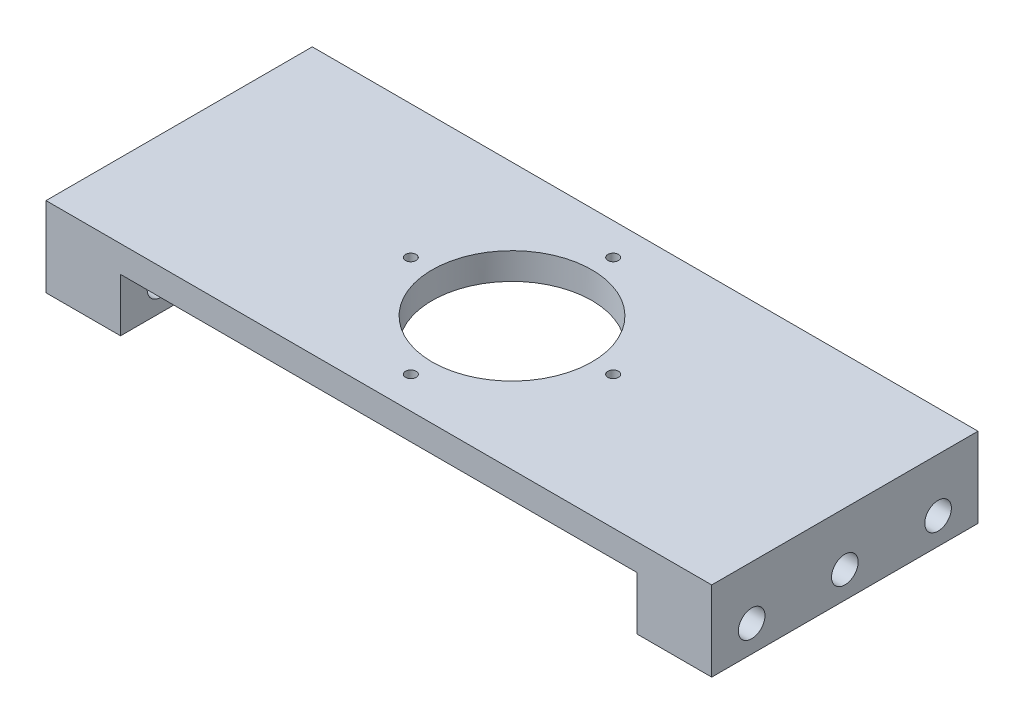
ISO-10303-21;
HEADER;
FILE_DESCRIPTION(('STEP AP214'),'2;1');
FILE_NAME('part.step','',(''),(''),'','','');
FILE_SCHEMA(('AUTOMOTIVE_DESIGN { 1 0 10303 214 1 1 1 1 }'));
ENDSEC;
DATA;
#1=APPLICATION_CONTEXT('core data for automotive mechanical design processes');
#2=APPLICATION_PROTOCOL_DEFINITION('international standard','automotive_design',2000,#1);
#3=PRODUCT_CONTEXT('',#1,'mechanical');
#4=PRODUCT('Part','Part','',(#3));
#5=PRODUCT_RELATED_PRODUCT_CATEGORY('part','',(#4));
#6=PRODUCT_DEFINITION_FORMATION('','',#4);
#7=PRODUCT_DEFINITION_CONTEXT('part definition',#1,'design');
#8=PRODUCT_DEFINITION('design','',#6,#7);
#9=PRODUCT_DEFINITION_SHAPE('','',#8);
#10=(LENGTH_UNIT() NAMED_UNIT(*) SI_UNIT(.MILLI.,.METRE.));
#11=(NAMED_UNIT(*) PLANE_ANGLE_UNIT() SI_UNIT($,.RADIAN.));
#12=(NAMED_UNIT(*) SI_UNIT($,.STERADIAN.) SOLID_ANGLE_UNIT());
#13=UNCERTAINTY_MEASURE_WITH_UNIT(LENGTH_MEASURE(1.E-05),#10,'distance_accuracy_value','');
#14=(GEOMETRIC_REPRESENTATION_CONTEXT(3) GLOBAL_UNCERTAINTY_ASSIGNED_CONTEXT((#13)) GLOBAL_UNIT_ASSIGNED_CONTEXT((#10,
#11,#12)) REPRESENTATION_CONTEXT('',''));
#15=CARTESIAN_POINT('',(0.,0.,0.));
#16=DIRECTION('',(0.,0.,1.));
#17=DIRECTION('',(1.,0.,0.));
#18=AXIS2_PLACEMENT_3D('',#15,#16,#17);
#19=CARTESIAN_POINT('',(0.,10.,50.));
#20=DIRECTION('',(0.,0.,-1.));
#21=DIRECTION('',(-1.,0.,0.));
#22=AXIS2_PLACEMENT_3D('',#19,#20,#21);
#23=PLANE('',#22);
#24=DIRECTION('',(0.,-1.,0.));
#25=VECTOR('',#24,1.);
#26=CARTESIAN_POINT('',(-125.,10.,50.));
#27=LINE('',#26,#25);
#28=CARTESIAN_POINT('',(-125.,10.,50.));
#29=VERTEX_POINT('',#28);
#30=CARTESIAN_POINT('',(-125.,-20.,50.));
#31=VERTEX_POINT('',#30);
#32=EDGE_CURVE('E187',#29,#31,#27,.T.);
#33=ORIENTED_EDGE('',*,*,#32,.T.);
#34=DIRECTION('',(-1.,0.,0.));
#35=VECTOR('',#34,1.);
#36=CARTESIAN_POINT('',(-125.,-20.,50.));
#37=LINE('',#36,#35);
#38=CARTESIAN_POINT('',(-97.,-20.,50.));
#39=VERTEX_POINT('',#38);
#40=EDGE_CURVE('E147',#39,#31,#37,.T.);
#41=ORIENTED_EDGE('',*,*,#40,.F.);
#42=DIRECTION('',(0.,1.,0.));
#43=VECTOR('',#42,1.);
#44=CARTESIAN_POINT('',(-97.,-20.,50.));
#45=LINE('',#44,#43);
#46=CARTESIAN_POINT('',(-97.,0.,50.));
#47=VERTEX_POINT('',#46);
#48=EDGE_CURVE('E161',#39,#47,#45,.T.);
#49=ORIENTED_EDGE('',*,*,#48,.T.);
#50=DIRECTION('',(1.,0.,0.));
#51=VECTOR('',#50,1.);
#52=CARTESIAN_POINT('',(0.,0.,50.));
#53=LINE('',#52,#51);
#54=CARTESIAN_POINT('',(97.,0.,50.));
#55=VERTEX_POINT('',#54);
#56=EDGE_CURVE('E112',#47,#55,#53,.T.);
#57=ORIENTED_EDGE('',*,*,#56,.T.);
#58=DIRECTION('',(0.,1.,0.));
#59=VECTOR('',#58,1.);
#60=CARTESIAN_POINT('',(97.,-20.,50.));
#61=LINE('',#60,#59);
#62=CARTESIAN_POINT('',(97.,-20.,50.));
#63=VERTEX_POINT('',#62);
#64=EDGE_CURVE('E106',#63,#55,#61,.T.);
#65=ORIENTED_EDGE('',*,*,#64,.F.);
#66=DIRECTION('',(1.,0.,0.));
#67=VECTOR('',#66,1.);
#68=CARTESIAN_POINT('',(125.,-20.,50.));
#69=LINE('',#68,#67);
#70=CARTESIAN_POINT('',(125.,-20.,50.));
#71=VERTEX_POINT('',#70);
#72=EDGE_CURVE('E109',#63,#71,#69,.T.);
#73=ORIENTED_EDGE('',*,*,#72,.T.);
#74=DIRECTION('',(0.,-1.,0.));
#75=VECTOR('',#74,1.);
#76=CARTESIAN_POINT('',(125.,10.,50.));
#77=LINE('',#76,#75);
#78=CARTESIAN_POINT('',(125.,10.,50.));
#79=VERTEX_POINT('',#78);
#80=EDGE_CURVE('E11',#79,#71,#77,.T.);
#81=ORIENTED_EDGE('',*,*,#80,.F.);
#82=DIRECTION('',(1.,0.,0.));
#83=VECTOR('',#82,1.);
#84=CARTESIAN_POINT('',(0.,10.,50.));
#85=LINE('',#84,#83);
#86=EDGE_CURVE('E176',#29,#79,#85,.T.);
#87=ORIENTED_EDGE('',*,*,#86,.F.);
#88=EDGE_LOOP('',(#33,#41,#49,#57,#65,#73,#81,#87));
#89=FACE_BOUND('',#88,.T.);
#90=ADVANCED_FACE('F39',(#89),#23,.F.);
#91=CARTESIAN_POINT('',(125.,10.,-50.));
#92=DIRECTION('',(-1.,0.,0.));
#93=DIRECTION('',(0.,0.,1.));
#94=AXIS2_PLACEMENT_3D('',#91,#92,#93);
#95=PLANE('',#94);
#96=CARTESIAN_POINT('',(125.,-10.,-35.));
#97=DIRECTION('',(1.,0.,0.));
#98=DIRECTION('',(0.,0.,-1.));
#99=AXIS2_PLACEMENT_3D('',#96,#97,#98);
#100=CIRCLE('',#99,5.);
#101=CARTESIAN_POINT('',(125.,-10.,-40.));
#102=VERTEX_POINT('',#101);
#103=EDGE_CURVE('E225',#102,#102,#100,.T.);
#104=ORIENTED_EDGE('',*,*,#103,.F.);
#105=EDGE_LOOP('',(#104));
#106=FACE_BOUND('',#105,.T.);
#107=CARTESIAN_POINT('',(125.,-10.,35.));
#108=DIRECTION('',(1.,0.,0.));
#109=DIRECTION('',(0.,0.,-1.));
#110=AXIS2_PLACEMENT_3D('',#107,#108,#109);
#111=CIRCLE('',#110,5.);
#112=CARTESIAN_POINT('',(125.,-10.,30.));
#113=VERTEX_POINT('',#112);
#114=EDGE_CURVE('E230',#113,#113,#111,.T.);
#115=ORIENTED_EDGE('',*,*,#114,.F.);
#116=EDGE_LOOP('',(#115));
#117=FACE_BOUND('',#116,.T.);
#118=CARTESIAN_POINT('',(125.,-10.,0.));
#119=DIRECTION('',(1.,0.,0.));
#120=DIRECTION('',(0.,0.,-1.));
#121=AXIS2_PLACEMENT_3D('',#118,#119,#120);
#122=CIRCLE('',#121,5.);
#123=CARTESIAN_POINT('',(125.,-10.,-5.));
#124=VERTEX_POINT('',#123);
#125=EDGE_CURVE('E207',#124,#124,#122,.T.);
#126=ORIENTED_EDGE('',*,*,#125,.F.);
#127=EDGE_LOOP('',(#126));
#128=FACE_BOUND('',#127,.T.);
#129=ORIENTED_EDGE('',*,*,#80,.T.);
#130=DIRECTION('',(0.,0.,-1.));
#131=VECTOR('',#130,1.);
#132=CARTESIAN_POINT('',(125.,-20.,50.));
#133=LINE('',#132,#131);
#134=CARTESIAN_POINT('',(125.,-20.,-50.));
#135=VERTEX_POINT('',#134);
#136=EDGE_CURVE('E128',#71,#135,#133,.T.);
#137=ORIENTED_EDGE('',*,*,#136,.T.);
#138=DIRECTION('',(0.,-1.,0.));
#139=VECTOR('',#138,1.);
#140=CARTESIAN_POINT('',(125.,10.,-50.));
#141=LINE('',#140,#139);
#142=CARTESIAN_POINT('',(125.,10.,-50.));
#143=VERTEX_POINT('',#142);
#144=EDGE_CURVE('E48',#143,#135,#141,.T.);
#145=ORIENTED_EDGE('',*,*,#144,.F.);
#146=DIRECTION('',(0.,0.,-1.));
#147=VECTOR('',#146,1.);
#148=CARTESIAN_POINT('',(125.,10.,-50.));
#149=LINE('',#148,#147);
#150=EDGE_CURVE('E179',#79,#143,#149,.T.);
#151=ORIENTED_EDGE('',*,*,#150,.F.);
#152=EDGE_LOOP('',(#129,#137,#145,#151));
#153=FACE_BOUND('',#152,.T.);
#154=ADVANCED_FACE('F244',(#106,#117,#128,#153),#95,.F.);
#155=CARTESIAN_POINT('',(-125.,10.,-50.));
#156=DIRECTION('',(0.,0.,1.));
#157=DIRECTION('',(1.,0.,0.));
#158=AXIS2_PLACEMENT_3D('',#155,#156,#157);
#159=PLANE('',#158);
#160=ORIENTED_EDGE('',*,*,#144,.T.);
#161=DIRECTION('',(-1.,0.,0.));
#162=VECTOR('',#161,1.);
#163=CARTESIAN_POINT('',(97.,-20.,-50.));
#164=LINE('',#163,#162);
#165=CARTESIAN_POINT('',(97.,-20.,-50.));
#166=VERTEX_POINT('',#165);
#167=EDGE_CURVE('E134',#135,#166,#164,.T.);
#168=ORIENTED_EDGE('',*,*,#167,.T.);
#169=DIRECTION('',(0.,1.,0.));
#170=VECTOR('',#169,1.);
#171=CARTESIAN_POINT('',(97.,-20.,-50.));
#172=LINE('',#171,#170);
#173=CARTESIAN_POINT('',(97.,0.,-50.));
#174=VERTEX_POINT('',#173);
#175=EDGE_CURVE('E119',#166,#174,#172,.T.);
#176=ORIENTED_EDGE('',*,*,#175,.T.);
#177=DIRECTION('',(-1.,0.,0.));
#178=VECTOR('',#177,1.);
#179=CARTESIAN_POINT('',(-125.,0.,-50.));
#180=LINE('',#179,#178);
#181=CARTESIAN_POINT('',(-97.,0.,-50.));
#182=VERTEX_POINT('',#181);
#183=EDGE_CURVE('E56',#174,#182,#180,.T.);
#184=ORIENTED_EDGE('',*,*,#183,.T.);
#185=DIRECTION('',(0.,1.,0.));
#186=VECTOR('',#185,1.);
#187=CARTESIAN_POINT('',(-97.,-20.,-50.));
#188=LINE('',#187,#186);
#189=CARTESIAN_POINT('',(-97.,-20.,-50.));
#190=VERTEX_POINT('',#189);
#191=EDGE_CURVE('E167',#190,#182,#188,.T.);
#192=ORIENTED_EDGE('',*,*,#191,.F.);
#193=DIRECTION('',(1.,0.,0.));
#194=VECTOR('',#193,1.);
#195=CARTESIAN_POINT('',(-97.,-20.,-50.));
#196=LINE('',#195,#194);
#197=CARTESIAN_POINT('',(-125.,-20.,-50.));
#198=VERTEX_POINT('',#197);
#199=EDGE_CURVE('E155',#198,#190,#196,.T.);
#200=ORIENTED_EDGE('',*,*,#199,.F.);
#201=DIRECTION('',(0.,-1.,0.));
#202=VECTOR('',#201,1.);
#203=CARTESIAN_POINT('',(-125.,10.,-50.));
#204=LINE('',#203,#202);
#205=CARTESIAN_POINT('',(-125.,10.,-50.));
#206=VERTEX_POINT('',#205);
#207=EDGE_CURVE('E194',#206,#198,#204,.T.);
#208=ORIENTED_EDGE('',*,*,#207,.F.);
#209=DIRECTION('',(-1.,0.,0.));
#210=VECTOR('',#209,1.);
#211=CARTESIAN_POINT('',(-125.,10.,-50.));
#212=LINE('',#211,#210);
#213=EDGE_CURVE('E182',#143,#206,#212,.T.);
#214=ORIENTED_EDGE('',*,*,#213,.F.);
#215=EDGE_LOOP('',(#160,#168,#176,#184,#192,#200,#208,#214));
#216=FACE_BOUND('',#215,.T.);
#217=ADVANCED_FACE('F247',(#216),#159,.F.);
#218=CARTESIAN_POINT('',(-125.,10.,50.));
#219=DIRECTION('',(1.,0.,0.));
#220=DIRECTION('',(0.,0.,-1.));
#221=AXIS2_PLACEMENT_3D('',#218,#219,#220);
#222=PLANE('',#221);
#223=CARTESIAN_POINT('',(-125.,-10.,-35.));
#224=DIRECTION('',(1.,0.,0.));
#225=DIRECTION('',(0.,0.,-1.));
#226=AXIS2_PLACEMENT_3D('',#223,#224,#225);
#227=CIRCLE('',#226,5.);
#228=CARTESIAN_POINT('',(-125.,-10.,-40.));
#229=VERTEX_POINT('',#228);
#230=EDGE_CURVE('E527',#229,#229,#227,.T.);
#231=ORIENTED_EDGE('',*,*,#230,.T.);
#232=EDGE_LOOP('',(#231));
#233=FACE_BOUND('',#232,.T.);
#234=CARTESIAN_POINT('',(-125.,-10.,35.));
#235=DIRECTION('',(1.,0.,0.));
#236=DIRECTION('',(0.,0.,-1.));
#237=AXIS2_PLACEMENT_3D('',#234,#235,#236);
#238=CIRCLE('',#237,5.);
#239=CARTESIAN_POINT('',(-125.,-10.,30.));
#240=VERTEX_POINT('',#239);
#241=EDGE_CURVE('E531',#240,#240,#238,.T.);
#242=ORIENTED_EDGE('',*,*,#241,.T.);
#243=EDGE_LOOP('',(#242));
#244=FACE_BOUND('',#243,.T.);
#245=CARTESIAN_POINT('',(-125.,-10.,0.));
#246=DIRECTION('',(1.,0.,0.));
#247=DIRECTION('',(0.,0.,-1.));
#248=AXIS2_PLACEMENT_3D('',#245,#246,#247);
#249=CIRCLE('',#248,5.);
#250=CARTESIAN_POINT('',(-125.,-10.,-5.));
#251=VERTEX_POINT('',#250);
#252=EDGE_CURVE('E218',#251,#251,#249,.T.);
#253=ORIENTED_EDGE('',*,*,#252,.T.);
#254=EDGE_LOOP('',(#253));
#255=FACE_BOUND('',#254,.T.);
#256=ORIENTED_EDGE('',*,*,#207,.T.);
#257=DIRECTION('',(0.,0.,-1.));
#258=VECTOR('',#257,1.);
#259=CARTESIAN_POINT('',(-125.,-20.,50.));
#260=LINE('',#259,#258);
#261=EDGE_CURVE('E151',#31,#198,#260,.T.);
#262=ORIENTED_EDGE('',*,*,#261,.F.);
#263=ORIENTED_EDGE('',*,*,#32,.F.);
#264=DIRECTION('',(0.,0.,1.));
#265=VECTOR('',#264,1.);
#266=CARTESIAN_POINT('',(-125.,10.,50.));
#267=LINE('',#266,#265);
#268=EDGE_CURVE('E64',#206,#29,#267,.T.);
#269=ORIENTED_EDGE('',*,*,#268,.F.);
#270=EDGE_LOOP('',(#256,#262,#263,#269));
#271=FACE_BOUND('',#270,.T.);
#272=ADVANCED_FACE('F259',(#233,#244,#255,#271),#222,.F.);
#273=CARTESIAN_POINT('',(0.,10.,0.));
#274=DIRECTION('',(0.,-1.,0.));
#275=DIRECTION('',(0.,0.,-1.));
#276=AXIS2_PLACEMENT_3D('',#273,#274,#275);
#277=PLANE('',#276);
#278=CARTESIAN_POINT('',(-38.,10.,1.32676290876039E-13));
#279=DIRECTION('',(0.,1.,0.));
#280=DIRECTION('',(1.,0.,0.));
#281=AXIS2_PLACEMENT_3D('',#278,#279,#280);
#282=CIRCLE('',#281,2.);
#283=CARTESIAN_POINT('',(-36.,10.,1.25693328198353E-13));
#284=VERTEX_POINT('',#283);
#285=EDGE_CURVE('E500',#284,#284,#282,.T.);
#286=ORIENTED_EDGE('',*,*,#285,.F.);
#287=EDGE_LOOP('',(#286));
#288=FACE_BOUND('',#287,.T.);
#289=CARTESIAN_POINT('',(0.,10.,38.));
#290=DIRECTION('',(0.,1.,0.));
#291=DIRECTION('',(0.,0.,-1.));
#292=AXIS2_PLACEMENT_3D('',#289,#290,#291);
#293=CIRCLE('',#292,2.);
#294=CARTESIAN_POINT('',(0.,10.,36.));
#295=VERTEX_POINT('',#294);
#296=EDGE_CURVE('E509',#295,#295,#293,.T.);
#297=ORIENTED_EDGE('',*,*,#296,.F.);
#298=EDGE_LOOP('',(#297));
#299=FACE_BOUND('',#298,.T.);
#300=CARTESIAN_POINT('',(38.,10.,-3.98028872628117E-13));
#301=DIRECTION('',(0.,1.,0.));
#302=DIRECTION('',(-1.,0.,0.));
#303=AXIS2_PLACEMENT_3D('',#300,#301,#302);
#304=CIRCLE('',#303,2.);
#305=CARTESIAN_POINT('',(36.,10.,-3.77079984595058E-13));
#306=VERTEX_POINT('',#305);
#307=EDGE_CURVE('E519',#306,#306,#304,.T.);
#308=ORIENTED_EDGE('',*,*,#307,.F.);
#309=EDGE_LOOP('',(#308));
#310=FACE_BOUND('',#309,.T.);
#311=CARTESIAN_POINT('',(0.,10.,-38.));
#312=DIRECTION('',(0.,1.,0.));
#313=DIRECTION('',(0.,0.,1.));
#314=AXIS2_PLACEMENT_3D('',#311,#312,#313);
#315=CIRCLE('',#314,2.);
#316=CARTESIAN_POINT('',(0.,10.,-36.));
#317=VERTEX_POINT('',#316);
#318=EDGE_CURVE('E506',#317,#317,#315,.T.);
#319=ORIENTED_EDGE('',*,*,#318,.F.);
#320=EDGE_LOOP('',(#319));
#321=FACE_BOUND('',#320,.T.);
#322=CARTESIAN_POINT('',(0.,10.,0.));
#323=DIRECTION('',(0.,1.,0.));
#324=DIRECTION('',(0.,0.,1.));
#325=AXIS2_PLACEMENT_3D('',#322,#323,#324);
#326=CIRCLE('',#325,30.);
#327=CARTESIAN_POINT('',(0.,10.,30.));
#328=VERTEX_POINT('',#327);
#329=EDGE_CURVE('E171',#328,#328,#326,.T.);
#330=ORIENTED_EDGE('',*,*,#329,.F.);
#331=EDGE_LOOP('',(#330));
#332=FACE_BOUND('',#331,.T.);
#333=ORIENTED_EDGE('',*,*,#86,.T.);
#334=ORIENTED_EDGE('',*,*,#150,.T.);
#335=ORIENTED_EDGE('',*,*,#213,.T.);
#336=ORIENTED_EDGE('',*,*,#268,.T.);
#337=EDGE_LOOP('',(#333,#334,#335,#336));
#338=FACE_BOUND('',#337,.T.);
#339=ADVANCED_FACE('F254',(#288,#299,#310,#321,#332,#338),#277,.F.);
#340=CARTESIAN_POINT('',(0.,0.,0.));
#341=DIRECTION('',(0.,-1.,0.));
#342=DIRECTION('',(0.,0.,-1.));
#343=AXIS2_PLACEMENT_3D('',#340,#341,#342);
#344=PLANE('',#343);
#345=CARTESIAN_POINT('',(-38.,0.,1.32676290876039E-13));
#346=DIRECTION('',(0.,1.,0.));
#347=DIRECTION('',(1.,0.,0.));
#348=AXIS2_PLACEMENT_3D('',#345,#346,#347);
#349=CIRCLE('',#348,2.);
#350=CARTESIAN_POINT('',(-36.,0.,1.25693328198353E-13));
#351=VERTEX_POINT('',#350);
#352=EDGE_CURVE('E498',#351,#351,#349,.T.);
#353=ORIENTED_EDGE('',*,*,#352,.T.);
#354=EDGE_LOOP('',(#353));
#355=FACE_BOUND('',#354,.T.);
#356=CARTESIAN_POINT('',(0.,0.,38.));
#357=DIRECTION('',(0.,1.,0.));
#358=DIRECTION('',(0.,0.,-1.));
#359=AXIS2_PLACEMENT_3D('',#356,#357,#358);
#360=CIRCLE('',#359,2.);
#361=CARTESIAN_POINT('',(0.,0.,36.));
#362=VERTEX_POINT('',#361);
#363=EDGE_CURVE('E502',#362,#362,#360,.T.);
#364=ORIENTED_EDGE('',*,*,#363,.T.);
#365=EDGE_LOOP('',(#364));
#366=FACE_BOUND('',#365,.T.);
#367=CARTESIAN_POINT('',(38.,0.,-3.98028872628117E-13));
#368=DIRECTION('',(0.,1.,0.));
#369=DIRECTION('',(-1.,0.,0.));
#370=AXIS2_PLACEMENT_3D('',#367,#368,#369);
#371=CIRCLE('',#370,2.);
#372=CARTESIAN_POINT('',(36.,0.,-3.77079984595058E-13));
#373=VERTEX_POINT('',#372);
#374=EDGE_CURVE('E515',#373,#373,#371,.T.);
#375=ORIENTED_EDGE('',*,*,#374,.T.);
#376=EDGE_LOOP('',(#375));
#377=FACE_BOUND('',#376,.T.);
#378=CARTESIAN_POINT('',(0.,0.,-38.));
#379=DIRECTION('',(0.,1.,0.));
#380=DIRECTION('',(0.,0.,1.));
#381=AXIS2_PLACEMENT_3D('',#378,#379,#380);
#382=CIRCLE('',#381,2.);
#383=CARTESIAN_POINT('',(0.,0.,-36.));
#384=VERTEX_POINT('',#383);
#385=EDGE_CURVE('E523',#384,#384,#382,.T.);
#386=ORIENTED_EDGE('',*,*,#385,.T.);
#387=EDGE_LOOP('',(#386));
#388=FACE_BOUND('',#387,.T.);
#389=DIRECTION('',(0.,0.,1.));
#390=VECTOR('',#389,1.);
#391=CARTESIAN_POINT('',(97.,0.,50.));
#392=LINE('',#391,#390);
#393=EDGE_CURVE('E130',#174,#55,#392,.T.);
#394=ORIENTED_EDGE('',*,*,#393,.T.);
#395=ORIENTED_EDGE('',*,*,#56,.F.);
#396=DIRECTION('',(0.,0.,1.));
#397=VECTOR('',#396,1.);
#398=CARTESIAN_POINT('',(-97.,0.,50.));
#399=LINE('',#398,#397);
#400=EDGE_CURVE('E118',#182,#47,#399,.T.);
#401=ORIENTED_EDGE('',*,*,#400,.F.);
#402=ORIENTED_EDGE('',*,*,#183,.F.);
#403=EDGE_LOOP('',(#394,#395,#401,#402));
#404=FACE_BOUND('',#403,.T.);
#405=CARTESIAN_POINT('',(0.,0.,0.));
#406=DIRECTION('',(0.,-1.,0.));
#407=DIRECTION('',(0.,0.,-1.));
#408=AXIS2_PLACEMENT_3D('',#405,#406,#407);
#409=CIRCLE('',#408,30.);
#410=CARTESIAN_POINT('',(0.,0.,-30.));
#411=VERTEX_POINT('',#410);
#412=EDGE_CURVE('E175',#411,#411,#409,.T.);
#413=ORIENTED_EDGE('',*,*,#412,.F.);
#414=EDGE_LOOP('',(#413));
#415=FACE_BOUND('',#414,.T.);
#416=ADVANCED_FACE('F267',(#355,#366,#377,#388,#404,#415),#344,.T.);
#417=CARTESIAN_POINT('',(0.,-5.,0.));
#418=DIRECTION('',(0.,1.,0.));
#419=DIRECTION('',(0.,0.,1.));
#420=AXIS2_PLACEMENT_3D('',#417,#418,#419);
#421=CYLINDRICAL_SURFACE('',#420,30.);
#422=ORIENTED_EDGE('',*,*,#412,.T.);
#423=EDGE_LOOP('',(#422));
#424=FACE_BOUND('',#423,.T.);
#425=ORIENTED_EDGE('',*,*,#329,.T.);
#426=EDGE_LOOP('',(#425));
#427=FACE_BOUND('',#426,.T.);
#428=ADVANCED_FACE('F270',(#424,#427),#421,.F.);
#429=CARTESIAN_POINT('',(-97.,-20.,50.));
#430=DIRECTION('',(-1.,0.,0.));
#431=DIRECTION('',(0.,0.,1.));
#432=AXIS2_PLACEMENT_3D('',#429,#430,#431);
#433=PLANE('',#432);
#434=CARTESIAN_POINT('',(-97.,-10.,-35.));
#435=DIRECTION('',(-1.,0.,0.));
#436=DIRECTION('',(0.,0.,1.));
#437=AXIS2_PLACEMENT_3D('',#434,#435,#436);
#438=CIRCLE('',#437,5.);
#439=CARTESIAN_POINT('',(-97.,-10.,-30.));
#440=VERTEX_POINT('',#439);
#441=EDGE_CURVE('E42',#440,#440,#438,.F.);
#442=ORIENTED_EDGE('',*,*,#441,.F.);
#443=EDGE_LOOP('',(#442));
#444=FACE_BOUND('',#443,.T.);
#445=CARTESIAN_POINT('',(-97.,-10.,35.));
#446=DIRECTION('',(-1.,0.,0.));
#447=DIRECTION('',(0.,0.,1.));
#448=AXIS2_PLACEMENT_3D('',#445,#446,#447);
#449=CIRCLE('',#448,5.);
#450=CARTESIAN_POINT('',(-97.,-10.,40.));
#451=VERTEX_POINT('',#450);
#452=EDGE_CURVE('E217',#451,#451,#449,.F.);
#453=ORIENTED_EDGE('',*,*,#452,.F.);
#454=EDGE_LOOP('',(#453));
#455=FACE_BOUND('',#454,.T.);
#456=CARTESIAN_POINT('',(-97.,-10.,0.));
#457=DIRECTION('',(-1.,0.,0.));
#458=DIRECTION('',(0.,0.,1.));
#459=AXIS2_PLACEMENT_3D('',#456,#457,#458);
#460=CIRCLE('',#459,5.);
#461=CARTESIAN_POINT('',(-97.,-10.,5.));
#462=VERTEX_POINT('',#461);
#463=EDGE_CURVE('E214',#462,#462,#460,.F.);
#464=ORIENTED_EDGE('',*,*,#463,.F.);
#465=EDGE_LOOP('',(#464));
#466=FACE_BOUND('',#465,.T.);
#467=ORIENTED_EDGE('',*,*,#400,.T.);
#468=ORIENTED_EDGE('',*,*,#48,.F.);
#469=DIRECTION('',(0.,0.,1.));
#470=VECTOR('',#469,1.);
#471=CARTESIAN_POINT('',(-97.,-20.,50.));
#472=LINE('',#471,#470);
#473=EDGE_CURVE('E158',#190,#39,#472,.T.);
#474=ORIENTED_EDGE('',*,*,#473,.F.);
#475=ORIENTED_EDGE('',*,*,#191,.T.);
#476=EDGE_LOOP('',(#467,#468,#474,#475));
#477=FACE_BOUND('',#476,.T.);
#478=ADVANCED_FACE('F265',(#444,#455,#466,#477),#433,.F.);
#479=CARTESIAN_POINT('',(0.,-20.,0.));
#480=DIRECTION('',(0.,1.,0.));
#481=DIRECTION('',(0.,0.,1.));
#482=AXIS2_PLACEMENT_3D('',#479,#480,#481);
#483=PLANE('',#482);
#484=ORIENTED_EDGE('',*,*,#40,.T.);
#485=ORIENTED_EDGE('',*,*,#261,.T.);
#486=ORIENTED_EDGE('',*,*,#199,.T.);
#487=ORIENTED_EDGE('',*,*,#473,.T.);
#488=EDGE_LOOP('',(#484,#485,#486,#487));
#489=FACE_BOUND('',#488,.T.);
#490=ADVANCED_FACE('F261',(#489),#483,.F.);
#491=CARTESIAN_POINT('',(97.,-20.,50.));
#492=DIRECTION('',(-1.,0.,0.));
#493=DIRECTION('',(0.,0.,1.));
#494=AXIS2_PLACEMENT_3D('',#491,#492,#493);
#495=PLANE('',#494);
#496=CARTESIAN_POINT('',(97.,-10.,-35.));
#497=DIRECTION('',(-1.,0.,0.));
#498=DIRECTION('',(0.,0.,1.));
#499=AXIS2_PLACEMENT_3D('',#496,#497,#498);
#500=CIRCLE('',#499,5.);
#501=CARTESIAN_POINT('',(97.,-10.,-30.));
#502=VERTEX_POINT('',#501);
#503=EDGE_CURVE('E144',#502,#502,#500,.T.);
#504=ORIENTED_EDGE('',*,*,#503,.F.);
#505=EDGE_LOOP('',(#504));
#506=FACE_BOUND('',#505,.T.);
#507=CARTESIAN_POINT('',(97.,-10.,35.));
#508=DIRECTION('',(-1.,0.,0.));
#509=DIRECTION('',(0.,0.,1.));
#510=AXIS2_PLACEMENT_3D('',#507,#508,#509);
#511=CIRCLE('',#510,5.);
#512=CARTESIAN_POINT('',(97.,-10.,40.));
#513=VERTEX_POINT('',#512);
#514=EDGE_CURVE('E206',#513,#513,#511,.T.);
#515=ORIENTED_EDGE('',*,*,#514,.F.);
#516=EDGE_LOOP('',(#515));
#517=FACE_BOUND('',#516,.T.);
#518=CARTESIAN_POINT('',(97.,-10.,0.));
#519=DIRECTION('',(-1.,0.,0.));
#520=DIRECTION('',(0.,0.,1.));
#521=AXIS2_PLACEMENT_3D('',#518,#519,#520);
#522=CIRCLE('',#521,5.);
#523=CARTESIAN_POINT('',(97.,-10.,5.));
#524=VERTEX_POINT('',#523);
#525=EDGE_CURVE('E202',#524,#524,#522,.T.);
#526=ORIENTED_EDGE('',*,*,#525,.F.);
#527=EDGE_LOOP('',(#526));
#528=FACE_BOUND('',#527,.T.);
#529=ORIENTED_EDGE('',*,*,#393,.F.);
#530=ORIENTED_EDGE('',*,*,#175,.F.);
#531=DIRECTION('',(0.,0.,1.));
#532=VECTOR('',#531,1.);
#533=CARTESIAN_POINT('',(97.,-20.,50.));
#534=LINE('',#533,#532);
#535=EDGE_CURVE('E125',#166,#63,#534,.T.);
#536=ORIENTED_EDGE('',*,*,#535,.T.);
#537=ORIENTED_EDGE('',*,*,#64,.T.);
#538=EDGE_LOOP('',(#529,#530,#536,#537));
#539=FACE_BOUND('',#538,.T.);
#540=ADVANCED_FACE('F132',(#506,#517,#528,#539),#495,.T.);
#541=CARTESIAN_POINT('',(0.,-20.,0.));
#542=DIRECTION('',(0.,1.,0.));
#543=DIRECTION('',(0.,0.,1.));
#544=AXIS2_PLACEMENT_3D('',#541,#542,#543);
#545=PLANE('',#544);
#546=ORIENTED_EDGE('',*,*,#72,.F.);
#547=ORIENTED_EDGE('',*,*,#535,.F.);
#548=ORIENTED_EDGE('',*,*,#167,.F.);
#549=ORIENTED_EDGE('',*,*,#136,.F.);
#550=EDGE_LOOP('',(#546,#547,#548,#549));
#551=FACE_BOUND('',#550,.T.);
#552=ADVANCED_FACE('F123',(#551),#545,.F.);
#553=CARTESIAN_POINT('',(95.,-10.,0.));
#554=DIRECTION('',(1.,0.,0.));
#555=DIRECTION('',(0.,0.,-1.));
#556=AXIS2_PLACEMENT_3D('',#553,#554,#555);
#557=CYLINDRICAL_SURFACE('',#556,5.);
#558=ORIENTED_EDGE('',*,*,#525,.T.);
#559=EDGE_LOOP('',(#558));
#560=FACE_BOUND('',#559,.T.);
#561=ORIENTED_EDGE('',*,*,#125,.T.);
#562=EDGE_LOOP('',(#561));
#563=FACE_BOUND('',#562,.T.);
#564=ADVANCED_FACE('F242',(#560,#563),#557,.F.);
#565=CARTESIAN_POINT('',(95.,-10.,35.));
#566=DIRECTION('',(1.,0.,0.));
#567=DIRECTION('',(0.,0.,-1.));
#568=AXIS2_PLACEMENT_3D('',#565,#566,#567);
#569=CYLINDRICAL_SURFACE('',#568,5.);
#570=ORIENTED_EDGE('',*,*,#514,.T.);
#571=EDGE_LOOP('',(#570));
#572=FACE_BOUND('',#571,.T.);
#573=ORIENTED_EDGE('',*,*,#114,.T.);
#574=EDGE_LOOP('',(#573));
#575=FACE_BOUND('',#574,.T.);
#576=ADVANCED_FACE('F417',(#572,#575),#569,.F.);
#577=CARTESIAN_POINT('',(95.,-10.,-35.));
#578=DIRECTION('',(1.,0.,0.));
#579=DIRECTION('',(0.,0.,-1.));
#580=AXIS2_PLACEMENT_3D('',#577,#578,#579);
#581=CYLINDRICAL_SURFACE('',#580,5.);
#582=ORIENTED_EDGE('',*,*,#503,.T.);
#583=EDGE_LOOP('',(#582));
#584=FACE_BOUND('',#583,.T.);
#585=ORIENTED_EDGE('',*,*,#103,.T.);
#586=EDGE_LOOP('',(#585));
#587=FACE_BOUND('',#586,.T.);
#588=ADVANCED_FACE('F319',(#584,#587),#581,.F.);
#589=CARTESIAN_POINT('',(-95.,-10.,0.));
#590=DIRECTION('',(-1.,0.,0.));
#591=DIRECTION('',(0.,0.,1.));
#592=AXIS2_PLACEMENT_3D('',#589,#590,#591);
#593=CYLINDRICAL_SURFACE('',#592,5.);
#594=ORIENTED_EDGE('',*,*,#252,.F.);
#595=EDGE_LOOP('',(#594));
#596=FACE_BOUND('',#595,.T.);
#597=ORIENTED_EDGE('',*,*,#463,.T.);
#598=EDGE_LOOP('',(#597));
#599=FACE_BOUND('',#598,.T.);
#600=ADVANCED_FACE('F334',(#596,#599),#593,.F.);
#601=CARTESIAN_POINT('',(-95.,-10.,35.));
#602=DIRECTION('',(-1.,0.,0.));
#603=DIRECTION('',(0.,0.,1.));
#604=AXIS2_PLACEMENT_3D('',#601,#602,#603);
#605=CYLINDRICAL_SURFACE('',#604,5.);
#606=ORIENTED_EDGE('',*,*,#241,.F.);
#607=EDGE_LOOP('',(#606));
#608=FACE_BOUND('',#607,.T.);
#609=ORIENTED_EDGE('',*,*,#452,.T.);
#610=EDGE_LOOP('',(#609));
#611=FACE_BOUND('',#610,.T.);
#612=ADVANCED_FACE('F339',(#608,#611),#605,.F.);
#613=CARTESIAN_POINT('',(-95.,-10.,-35.));
#614=DIRECTION('',(-1.,0.,0.));
#615=DIRECTION('',(0.,0.,1.));
#616=AXIS2_PLACEMENT_3D('',#613,#614,#615);
#617=CYLINDRICAL_SURFACE('',#616,5.);
#618=ORIENTED_EDGE('',*,*,#230,.F.);
#619=EDGE_LOOP('',(#618));
#620=FACE_BOUND('',#619,.T.);
#621=ORIENTED_EDGE('',*,*,#441,.T.);
#622=EDGE_LOOP('',(#621));
#623=FACE_BOUND('',#622,.T.);
#624=ADVANCED_FACE('F349',(#620,#623),#617,.F.);
#625=CARTESIAN_POINT('',(0.,0.,-38.));
#626=DIRECTION('',(0.,1.,0.));
#627=DIRECTION('',(0.,0.,1.));
#628=AXIS2_PLACEMENT_3D('',#625,#626,#627);
#629=CYLINDRICAL_SURFACE('',#628,2.);
#630=ORIENTED_EDGE('',*,*,#385,.F.);
#631=EDGE_LOOP('',(#630));
#632=FACE_BOUND('',#631,.T.);
#633=ORIENTED_EDGE('',*,*,#318,.T.);
#634=EDGE_LOOP('',(#633));
#635=FACE_BOUND('',#634,.T.);
#636=ADVANCED_FACE('F359',(#632,#635),#629,.F.);
#637=CARTESIAN_POINT('',(38.,0.,-3.98028872628117E-13));
#638=DIRECTION('',(0.,1.,0.));
#639=DIRECTION('',(0.,0.,1.));
#640=AXIS2_PLACEMENT_3D('',#637,#638,#639);
#641=CYLINDRICAL_SURFACE('',#640,2.);
#642=ORIENTED_EDGE('',*,*,#374,.F.);
#643=EDGE_LOOP('',(#642));
#644=FACE_BOUND('',#643,.T.);
#645=ORIENTED_EDGE('',*,*,#307,.T.);
#646=EDGE_LOOP('',(#645));
#647=FACE_BOUND('',#646,.T.);
#648=ADVANCED_FACE('F368',(#644,#647),#641,.F.);
#649=CARTESIAN_POINT('',(0.,0.,38.));
#650=DIRECTION('',(0.,1.,0.));
#651=DIRECTION('',(0.,0.,1.));
#652=AXIS2_PLACEMENT_3D('',#649,#650,#651);
#653=CYLINDRICAL_SURFACE('',#652,2.);
#654=ORIENTED_EDGE('',*,*,#363,.F.);
#655=EDGE_LOOP('',(#654));
#656=FACE_BOUND('',#655,.T.);
#657=ORIENTED_EDGE('',*,*,#296,.T.);
#658=EDGE_LOOP('',(#657));
#659=FACE_BOUND('',#658,.T.);
#660=ADVANCED_FACE('F390',(#656,#659),#653,.F.);
#661=CARTESIAN_POINT('',(-38.,0.,1.32676290876039E-13));
#662=DIRECTION('',(0.,1.,0.));
#663=DIRECTION('',(0.,0.,1.));
#664=AXIS2_PLACEMENT_3D('',#661,#662,#663);
#665=CYLINDRICAL_SURFACE('',#664,2.);
#666=ORIENTED_EDGE('',*,*,#352,.F.);
#667=EDGE_LOOP('',(#666));
#668=FACE_BOUND('',#667,.T.);
#669=ORIENTED_EDGE('',*,*,#285,.T.);
#670=EDGE_LOOP('',(#669));
#671=FACE_BOUND('',#670,.T.);
#672=ADVANCED_FACE('F400',(#668,#671),#665,.F.);
#673=CLOSED_SHELL('',(#90,#154,#217,#272,#339,#416,#428,#478,#490,#540,#552,#564,#576,#588,#600,
#612,#624,#636,#648,#660,#672));
#674=MANIFOLD_SOLID_BREP('B2',#673);
#675=ADVANCED_BREP_SHAPE_REPRESENTATION('',(#18,#674),#14);
#676=SHAPE_DEFINITION_REPRESENTATION(#9,#675);
ENDSEC;
END-ISO-10303-21;
